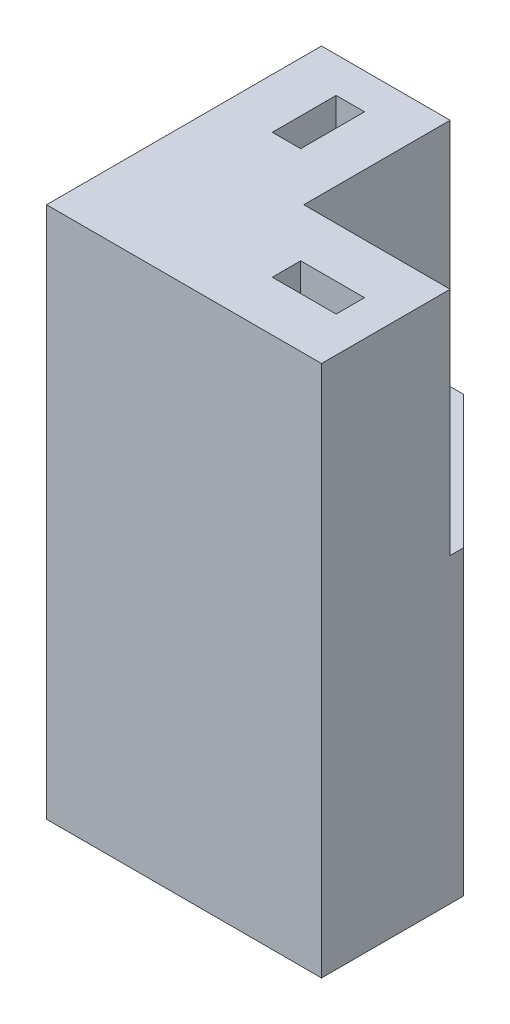
ISO-10303-21;
HEADER;
FILE_DESCRIPTION(('STEP AP214'),'2;1');
FILE_NAME('part.step','',(''),(''),'','','');
FILE_SCHEMA(('AUTOMOTIVE_DESIGN { 1 0 10303 214 1 1 1 1 }'));
ENDSEC;
DATA;
#1=APPLICATION_CONTEXT('core data for automotive mechanical design processes');
#2=APPLICATION_PROTOCOL_DEFINITION('international standard','automotive_design',2000,#1);
#3=PRODUCT_CONTEXT('',#1,'mechanical');
#4=PRODUCT('Part','Part','',(#3));
#5=PRODUCT_RELATED_PRODUCT_CATEGORY('part','',(#4));
#6=PRODUCT_DEFINITION_FORMATION('','',#4);
#7=PRODUCT_DEFINITION_CONTEXT('part definition',#1,'design');
#8=PRODUCT_DEFINITION('design','',#6,#7);
#9=PRODUCT_DEFINITION_SHAPE('','',#8);
#10=(LENGTH_UNIT() NAMED_UNIT(*) SI_UNIT(.MILLI.,.METRE.));
#11=(NAMED_UNIT(*) PLANE_ANGLE_UNIT() SI_UNIT($,.RADIAN.));
#12=(NAMED_UNIT(*) SI_UNIT($,.STERADIAN.) SOLID_ANGLE_UNIT());
#13=UNCERTAINTY_MEASURE_WITH_UNIT(LENGTH_MEASURE(1.E-05),#10,'distance_accuracy_value','');
#14=(GEOMETRIC_REPRESENTATION_CONTEXT(3) GLOBAL_UNCERTAINTY_ASSIGNED_CONTEXT((#13)) GLOBAL_UNIT_ASSIGNED_CONTEXT((#10,
#11,#12)) REPRESENTATION_CONTEXT('',''));
#15=CARTESIAN_POINT('',(0.,0.,0.));
#16=DIRECTION('',(0.,0.,1.));
#17=DIRECTION('',(1.,0.,0.));
#18=AXIS2_PLACEMENT_3D('',#15,#16,#17);
#19=CARTESIAN_POINT('',(9.8425,38.1,9.8425));
#20=DIRECTION('',(-1.,0.,0.));
#21=DIRECTION('',(0.,0.,1.));
#22=AXIS2_PLACEMENT_3D('',#19,#20,#21);
#23=PLANE('',#22);
#24=DIRECTION('',(0.,0.,-1.));
#25=VECTOR('',#24,1.);
#26=CARTESIAN_POINT('',(9.8425,0.,9.8425));
#27=LINE('',#26,#25);
#28=CARTESIAN_POINT('',(9.8425,0.,9.8425));
#29=VERTEX_POINT('',#28);
#30=CARTESIAN_POINT('',(9.8425,0.,-0.317499999999962));
#31=VERTEX_POINT('',#30);
#32=EDGE_CURVE('E249',#29,#31,#27,.T.);
#33=ORIENTED_EDGE('',*,*,#32,.T.);
#34=DIRECTION('',(0.,1.,0.));
#35=VECTOR('',#34,1.);
#36=CARTESIAN_POINT('',(9.8425,38.1,-0.317499999999962));
#37=LINE('',#36,#35);
#38=CARTESIAN_POINT('',(9.8425,21.59,-0.317499999999962));
#39=VERTEX_POINT('',#38);
#40=EDGE_CURVE('E44',#31,#39,#37,.T.);
#41=ORIENTED_EDGE('',*,*,#40,.T.);
#42=DIRECTION('',(0.,0.,-1.));
#43=VECTOR('',#42,1.);
#44=CARTESIAN_POINT('',(9.8425,21.59,-9.8425));
#45=LINE('',#44,#43);
#46=CARTESIAN_POINT('',(9.8425,21.59,0.634999999999998));
#47=VERTEX_POINT('',#46);
#48=EDGE_CURVE('E224',#47,#39,#45,.T.);
#49=ORIENTED_EDGE('',*,*,#48,.F.);
#50=DIRECTION('',(0.,1.,0.));
#51=VECTOR('',#50,1.);
#52=CARTESIAN_POINT('',(9.8425,21.59,0.634999999999998));
#53=LINE('',#52,#51);
#54=CARTESIAN_POINT('',(9.8425,38.1,0.634999999999998));
#55=VERTEX_POINT('',#54);
#56=EDGE_CURVE('E239',#47,#55,#53,.T.);
#57=ORIENTED_EDGE('',*,*,#56,.T.);
#58=DIRECTION('',(0.,0.,-1.));
#59=VECTOR('',#58,1.);
#60=CARTESIAN_POINT('',(9.8425,38.1,9.8425));
#61=LINE('',#60,#59);
#62=CARTESIAN_POINT('',(9.8425,38.1,9.8425));
#63=VERTEX_POINT('',#62);
#64=EDGE_CURVE('E252',#63,#55,#61,.T.);
#65=ORIENTED_EDGE('',*,*,#64,.F.);
#66=DIRECTION('',(0.,-1.,0.));
#67=VECTOR('',#66,1.);
#68=CARTESIAN_POINT('',(9.8425,38.1,9.8425));
#69=LINE('',#68,#67);
#70=EDGE_CURVE('E262',#63,#29,#69,.T.);
#71=ORIENTED_EDGE('',*,*,#70,.T.);
#72=EDGE_LOOP('',(#33,#41,#49,#57,#65,#71));
#73=FACE_BOUND('',#72,.T.);
#74=ADVANCED_FACE('F36',(#73),#23,.F.);
#75=CARTESIAN_POINT('',(-9.8425,38.1,-9.8425));
#76=DIRECTION('',(0.,0.,1.));
#77=DIRECTION('',(1.,0.,0.));
#78=AXIS2_PLACEMENT_3D('',#75,#76,#77);
#79=PLANE('',#78);
#80=DIRECTION('',(-1.,0.,0.));
#81=VECTOR('',#80,1.);
#82=CARTESIAN_POINT('',(-0.634999999999997,21.59,-9.8425));
#83=LINE('',#82,#81);
#84=CARTESIAN_POINT('',(0.3175,21.59,-9.8425));
#85=VERTEX_POINT('',#84);
#86=CARTESIAN_POINT('',(-0.634999999999997,21.59,-9.8425));
#87=VERTEX_POINT('',#86);
#88=EDGE_CURVE('E226',#85,#87,#83,.T.);
#89=ORIENTED_EDGE('',*,*,#88,.F.);
#90=DIRECTION('',(0.,-1.,0.));
#91=VECTOR('',#90,1.);
#92=CARTESIAN_POINT('',(0.3175,38.1,-9.8425));
#93=LINE('',#92,#91);
#94=CARTESIAN_POINT('',(0.3175,0.,-9.8425));
#95=VERTEX_POINT('',#94);
#96=EDGE_CURVE('E277',#85,#95,#93,.T.);
#97=ORIENTED_EDGE('',*,*,#96,.T.);
#98=DIRECTION('',(-1.,0.,0.));
#99=VECTOR('',#98,1.);
#100=CARTESIAN_POINT('',(-9.8425,0.,-9.8425));
#101=LINE('',#100,#99);
#102=CARTESIAN_POINT('',(-9.8425,0.,-9.8425));
#103=VERTEX_POINT('',#102);
#104=EDGE_CURVE('E264',#95,#103,#101,.T.);
#105=ORIENTED_EDGE('',*,*,#104,.T.);
#106=DIRECTION('',(0.,-1.,0.));
#107=VECTOR('',#106,1.);
#108=CARTESIAN_POINT('',(-9.8425,38.1,-9.8425));
#109=LINE('',#108,#107);
#110=CARTESIAN_POINT('',(-9.8425,38.1,-9.8425));
#111=VERTEX_POINT('',#110);
#112=EDGE_CURVE('E274',#111,#103,#109,.T.);
#113=ORIENTED_EDGE('',*,*,#112,.F.);
#114=DIRECTION('',(-1.,0.,0.));
#115=VECTOR('',#114,1.);
#116=CARTESIAN_POINT('',(-9.8425,38.1,-9.8425));
#117=LINE('',#116,#115);
#118=CARTESIAN_POINT('',(-0.634999999999997,38.1,-9.8425));
#119=VERTEX_POINT('',#118);
#120=EDGE_CURVE('E255',#119,#111,#117,.T.);
#121=ORIENTED_EDGE('',*,*,#120,.F.);
#122=DIRECTION('',(0.,1.,0.));
#123=VECTOR('',#122,1.);
#124=CARTESIAN_POINT('',(-0.634999999999997,21.59,-9.8425));
#125=LINE('',#124,#123);
#126=EDGE_CURVE('E235',#87,#119,#125,.T.);
#127=ORIENTED_EDGE('',*,*,#126,.F.);
#128=EDGE_LOOP('',(#89,#97,#105,#113,#121,#127));
#129=FACE_BOUND('',#128,.T.);
#130=ADVANCED_FACE('F283',(#129),#79,.F.);
#131=CARTESIAN_POINT('',(-9.8425,38.1,9.8425));
#132=DIRECTION('',(1.,0.,0.));
#133=DIRECTION('',(0.,0.,-1.));
#134=AXIS2_PLACEMENT_3D('',#131,#132,#133);
#135=PLANE('',#134);
#136=DIRECTION('',(0.,0.,1.));
#137=VECTOR('',#136,1.);
#138=CARTESIAN_POINT('',(-9.8425,0.,9.8425));
#139=LINE('',#138,#137);
#140=CARTESIAN_POINT('',(-9.8425,0.,9.8425));
#141=VERTEX_POINT('',#140);
#142=EDGE_CURVE('E266',#103,#141,#139,.T.);
#143=ORIENTED_EDGE('',*,*,#142,.T.);
#144=DIRECTION('',(0.,-1.,0.));
#145=VECTOR('',#144,1.);
#146=CARTESIAN_POINT('',(-9.8425,38.1,9.8425));
#147=LINE('',#146,#145);
#148=CARTESIAN_POINT('',(-9.8425,38.1,9.8425));
#149=VERTEX_POINT('',#148);
#150=EDGE_CURVE('E271',#149,#141,#147,.T.);
#151=ORIENTED_EDGE('',*,*,#150,.F.);
#152=DIRECTION('',(0.,0.,1.));
#153=VECTOR('',#152,1.);
#154=CARTESIAN_POINT('',(-9.8425,38.1,9.8425));
#155=LINE('',#154,#153);
#156=EDGE_CURVE('E258',#111,#149,#155,.T.);
#157=ORIENTED_EDGE('',*,*,#156,.F.);
#158=ORIENTED_EDGE('',*,*,#112,.T.);
#159=EDGE_LOOP('',(#143,#151,#157,#158));
#160=FACE_BOUND('',#159,.T.);
#161=ADVANCED_FACE('F293',(#160),#135,.F.);
#162=CARTESIAN_POINT('',(-9.8425,38.1,9.8425));
#163=DIRECTION('',(0.,0.,-1.));
#164=DIRECTION('',(-1.,0.,0.));
#165=AXIS2_PLACEMENT_3D('',#162,#163,#164);
#166=PLANE('',#165);
#167=DIRECTION('',(1.,0.,0.));
#168=VECTOR('',#167,1.);
#169=CARTESIAN_POINT('',(-9.8425,0.,9.8425));
#170=LINE('',#169,#168);
#171=EDGE_CURVE('E256',#141,#29,#170,.T.);
#172=ORIENTED_EDGE('',*,*,#171,.T.);
#173=ORIENTED_EDGE('',*,*,#70,.F.);
#174=DIRECTION('',(1.,0.,0.));
#175=VECTOR('',#174,1.);
#176=CARTESIAN_POINT('',(-9.8425,38.1,9.8425));
#177=LINE('',#176,#175);
#178=EDGE_CURVE('E260',#149,#63,#177,.T.);
#179=ORIENTED_EDGE('',*,*,#178,.F.);
#180=ORIENTED_EDGE('',*,*,#150,.T.);
#181=EDGE_LOOP('',(#172,#173,#179,#180));
#182=FACE_BOUND('',#181,.T.);
#183=ADVANCED_FACE('F297',(#182),#166,.F.);
#184=CARTESIAN_POINT('',(0.,38.1,0.));
#185=DIRECTION('',(0.,-1.,0.));
#186=DIRECTION('',(0.,0.,-1.));
#187=AXIS2_PLACEMENT_3D('',#184,#185,#186);
#188=PLANE('',#187);
#189=DIRECTION('',(-1.,0.,0.));
#190=VECTOR('',#189,1.);
#191=CARTESIAN_POINT('',(-6.25475,38.1,-7.3025));
#192=LINE('',#191,#190);
#193=CARTESIAN_POINT('',(-4.22275,38.1,-7.3025));
#194=VERTEX_POINT('',#193);
#195=CARTESIAN_POINT('',(-6.25475,38.1,-7.3025));
#196=VERTEX_POINT('',#195);
#197=EDGE_CURVE('E182',#194,#196,#192,.T.);
#198=ORIENTED_EDGE('',*,*,#197,.F.);
#199=DIRECTION('',(0.,0.,-1.));
#200=VECTOR('',#199,1.);
#201=CARTESIAN_POINT('',(-4.22275,38.1,-2.7305));
#202=LINE('',#201,#200);
#203=CARTESIAN_POINT('',(-4.22275,38.1,-2.7305));
#204=VERTEX_POINT('',#203);
#205=EDGE_CURVE('E156',#204,#194,#202,.T.);
#206=ORIENTED_EDGE('',*,*,#205,.F.);
#207=DIRECTION('',(1.,0.,0.));
#208=VECTOR('',#207,1.);
#209=CARTESIAN_POINT('',(-6.25475,38.1,-2.7305));
#210=LINE('',#209,#208);
#211=CARTESIAN_POINT('',(-6.25475,38.1,-2.7305));
#212=VERTEX_POINT('',#211);
#213=EDGE_CURVE('E173',#212,#204,#210,.T.);
#214=ORIENTED_EDGE('',*,*,#213,.F.);
#215=DIRECTION('',(0.,0.,1.));
#216=VECTOR('',#215,1.);
#217=CARTESIAN_POINT('',(-6.25475,38.1,-2.7305));
#218=LINE('',#217,#216);
#219=EDGE_CURVE('E176',#196,#212,#218,.T.);
#220=ORIENTED_EDGE('',*,*,#219,.F.);
#221=EDGE_LOOP('',(#198,#206,#214,#220));
#222=FACE_BOUND('',#221,.T.);
#223=DIRECTION('',(-1.,0.,0.));
#224=VECTOR('',#223,1.);
#225=CARTESIAN_POINT('',(2.7305,38.1,4.22275));
#226=LINE('',#225,#224);
#227=CARTESIAN_POINT('',(7.3025,38.1,4.22275));
#228=VERTEX_POINT('',#227);
#229=CARTESIAN_POINT('',(2.7305,38.1,4.22275));
#230=VERTEX_POINT('',#229);
#231=EDGE_CURVE('E209',#228,#230,#226,.T.);
#232=ORIENTED_EDGE('',*,*,#231,.F.);
#233=DIRECTION('',(0.,0.,-1.));
#234=VECTOR('',#233,1.);
#235=CARTESIAN_POINT('',(7.3025,38.1,6.25475));
#236=LINE('',#235,#234);
#237=CARTESIAN_POINT('',(7.3025,38.1,6.25475));
#238=VERTEX_POINT('',#237);
#239=EDGE_CURVE('E207',#238,#228,#236,.T.);
#240=ORIENTED_EDGE('',*,*,#239,.F.);
#241=DIRECTION('',(1.,0.,0.));
#242=VECTOR('',#241,1.);
#243=CARTESIAN_POINT('',(2.7305,38.1,6.25475));
#244=LINE('',#243,#242);
#245=CARTESIAN_POINT('',(2.7305,38.1,6.25475));
#246=VERTEX_POINT('',#245);
#247=EDGE_CURVE('E197',#246,#238,#244,.T.);
#248=ORIENTED_EDGE('',*,*,#247,.F.);
#249=DIRECTION('',(0.,0.,1.));
#250=VECTOR('',#249,1.);
#251=CARTESIAN_POINT('',(2.7305,38.1,6.25475));
#252=LINE('',#251,#250);
#253=EDGE_CURVE('E212',#230,#246,#252,.T.);
#254=ORIENTED_EDGE('',*,*,#253,.F.);
#255=EDGE_LOOP('',(#232,#240,#248,#254));
#256=FACE_BOUND('',#255,.T.);
#257=ORIENTED_EDGE('',*,*,#64,.T.);
#258=DIRECTION('',(1.,0.,0.));
#259=VECTOR('',#258,1.);
#260=CARTESIAN_POINT('',(9.8425,38.1,0.634999999999998));
#261=LINE('',#260,#259);
#262=CARTESIAN_POINT('',(-0.634999999999997,38.1,0.635));
#263=VERTEX_POINT('',#262);
#264=EDGE_CURVE('E227',#263,#55,#261,.T.);
#265=ORIENTED_EDGE('',*,*,#264,.F.);
#266=DIRECTION('',(0.,0.,1.));
#267=VECTOR('',#266,1.);
#268=CARTESIAN_POINT('',(-0.634999999999997,38.1,0.635));
#269=LINE('',#268,#267);
#270=EDGE_CURVE('E189',#119,#263,#269,.T.);
#271=ORIENTED_EDGE('',*,*,#270,.F.);
#272=ORIENTED_EDGE('',*,*,#120,.T.);
#273=ORIENTED_EDGE('',*,*,#156,.T.);
#274=ORIENTED_EDGE('',*,*,#178,.T.);
#275=EDGE_LOOP('',(#257,#265,#271,#272,#273,#274));
#276=FACE_BOUND('',#275,.T.);
#277=ADVANCED_FACE('F301',(#222,#256,#276),#188,.F.);
#278=CARTESIAN_POINT('',(0.,0.,0.));
#279=DIRECTION('',(0.,-1.,0.));
#280=DIRECTION('',(0.,0.,-1.));
#281=AXIS2_PLACEMENT_3D('',#278,#279,#280);
#282=PLANE('',#281);
#283=CARTESIAN_POINT('',(-4.92125,0.,4.92125));
#284=DIRECTION('',(0.,-1.,0.));
#285=DIRECTION('',(0.,0.,-1.));
#286=AXIS2_PLACEMENT_3D('',#283,#284,#285);
#287=CIRCLE('',#286,2.54);
#288=CARTESIAN_POINT('',(-4.92125,0.,2.38125));
#289=VERTEX_POINT('',#288);
#290=EDGE_CURVE('E242',#289,#289,#287,.T.);
#291=ORIENTED_EDGE('',*,*,#290,.F.);
#292=EDGE_LOOP('',(#291));
#293=FACE_BOUND('',#292,.T.);
#294=ORIENTED_EDGE('',*,*,#104,.F.);
#295=DIRECTION('',(-0.707106781186546,0.,-0.707106781186549));
#296=VECTOR('',#295,1.);
#297=CARTESIAN_POINT('',(5.08,0.,-5.07999999999998));
#298=LINE('',#297,#296);
#299=EDGE_CURVE('E58',#95,#31,#298,.F.);
#300=ORIENTED_EDGE('',*,*,#299,.T.);
#301=ORIENTED_EDGE('',*,*,#32,.F.);
#302=ORIENTED_EDGE('',*,*,#171,.F.);
#303=ORIENTED_EDGE('',*,*,#142,.F.);
#304=EDGE_LOOP('',(#294,#300,#301,#302,#303));
#305=FACE_BOUND('',#304,.T.);
#306=ADVANCED_FACE('F289',(#293,#305),#282,.T.);
#307=CARTESIAN_POINT('',(-4.92125,5.715,4.92125));
#308=DIRECTION('',(0.,-1.,0.));
#309=DIRECTION('',(0.,0.,-1.));
#310=AXIS2_PLACEMENT_3D('',#307,#308,#309);
#311=CYLINDRICAL_SURFACE('',#310,2.54);
#312=CARTESIAN_POINT('',(-4.92125,5.715,4.92125));
#313=DIRECTION('',(0.,-1.,0.));
#314=DIRECTION('',(0.,0.,-1.));
#315=AXIS2_PLACEMENT_3D('',#312,#313,#314);
#316=CIRCLE('',#315,2.54);
#317=CARTESIAN_POINT('',(-4.92125,5.715,2.38125));
#318=VERTEX_POINT('',#317);
#319=EDGE_CURVE('E246',#318,#318,#316,.T.);
#320=ORIENTED_EDGE('',*,*,#319,.F.);
#321=EDGE_LOOP('',(#320));
#322=FACE_BOUND('',#321,.T.);
#323=ORIENTED_EDGE('',*,*,#290,.T.);
#324=EDGE_LOOP('',(#323));
#325=FACE_BOUND('',#324,.T.);
#326=ADVANCED_FACE('F330',(#322,#325),#311,.F.);
#327=CARTESIAN_POINT('',(-4.92125,5.715,4.92125));
#328=DIRECTION('',(0.,-1.,0.));
#329=DIRECTION('',(0.,0.,-1.));
#330=AXIS2_PLACEMENT_3D('',#327,#328,#329);
#331=PLANE('',#330);
#332=ORIENTED_EDGE('',*,*,#319,.T.);
#333=EDGE_LOOP('',(#332));
#334=FACE_BOUND('',#333,.T.);
#335=ADVANCED_FACE('F337',(#334),#331,.T.);
#336=CARTESIAN_POINT('',(9.8425,21.59,0.634999999999998));
#337=DIRECTION('',(0.,0.,1.));
#338=DIRECTION('',(1.,0.,0.));
#339=AXIS2_PLACEMENT_3D('',#336,#337,#338);
#340=PLANE('',#339);
#341=ORIENTED_EDGE('',*,*,#264,.T.);
#342=ORIENTED_EDGE('',*,*,#56,.F.);
#343=DIRECTION('',(1.,0.,0.));
#344=VECTOR('',#343,1.);
#345=CARTESIAN_POINT('',(9.8425,21.59,0.634999999999998));
#346=LINE('',#345,#344);
#347=CARTESIAN_POINT('',(-0.634999999999997,21.59,0.635));
#348=VERTEX_POINT('',#347);
#349=EDGE_CURVE('E232',#348,#47,#346,.T.);
#350=ORIENTED_EDGE('',*,*,#349,.F.);
#351=DIRECTION('',(0.,1.,0.));
#352=VECTOR('',#351,1.);
#353=CARTESIAN_POINT('',(-0.634999999999997,21.59,0.635));
#354=LINE('',#353,#352);
#355=EDGE_CURVE('E243',#348,#263,#354,.T.);
#356=ORIENTED_EDGE('',*,*,#355,.T.);
#357=EDGE_LOOP('',(#341,#342,#350,#356));
#358=FACE_BOUND('',#357,.T.);
#359=ADVANCED_FACE('F312',(#358),#340,.F.);
#360=CARTESIAN_POINT('',(-0.634999999999997,21.59,0.635));
#361=DIRECTION('',(-1.,0.,0.));
#362=DIRECTION('',(0.,0.,1.));
#363=AXIS2_PLACEMENT_3D('',#360,#361,#362);
#364=PLANE('',#363);
#365=ORIENTED_EDGE('',*,*,#270,.T.);
#366=ORIENTED_EDGE('',*,*,#355,.F.);
#367=DIRECTION('',(0.,0.,1.));
#368=VECTOR('',#367,1.);
#369=CARTESIAN_POINT('',(-0.634999999999997,21.59,0.635));
#370=LINE('',#369,#368);
#371=EDGE_CURVE('E229',#87,#348,#370,.T.);
#372=ORIENTED_EDGE('',*,*,#371,.F.);
#373=ORIENTED_EDGE('',*,*,#126,.T.);
#374=EDGE_LOOP('',(#365,#366,#372,#373));
#375=FACE_BOUND('',#374,.T.);
#376=ADVANCED_FACE('F307',(#375),#364,.F.);
#377=CARTESIAN_POINT('',(0.,21.59,0.));
#378=DIRECTION('',(0.,-1.,0.));
#379=DIRECTION('',(0.,0.,-1.));
#380=AXIS2_PLACEMENT_3D('',#377,#378,#379);
#381=PLANE('',#380);
#382=ORIENTED_EDGE('',*,*,#48,.T.);
#383=DIRECTION('',(0.707106781186546,0.,0.707106781186549));
#384=VECTOR('',#383,1.);
#385=CARTESIAN_POINT('',(0.3175,21.59,-9.8425));
#386=LINE('',#385,#384);
#387=EDGE_CURVE('E11',#39,#85,#386,.F.);
#388=ORIENTED_EDGE('',*,*,#387,.T.);
#389=ORIENTED_EDGE('',*,*,#88,.T.);
#390=ORIENTED_EDGE('',*,*,#371,.T.);
#391=ORIENTED_EDGE('',*,*,#349,.T.);
#392=EDGE_LOOP('',(#382,#388,#389,#390,#391));
#393=FACE_BOUND('',#392,.T.);
#394=ADVANCED_FACE('F310',(#393),#381,.F.);
#395=CARTESIAN_POINT('',(7.3025,33.02,6.25475));
#396=DIRECTION('',(1.,0.,0.));
#397=DIRECTION('',(0.,0.,-1.));
#398=AXIS2_PLACEMENT_3D('',#395,#396,#397);
#399=PLANE('',#398);
#400=ORIENTED_EDGE('',*,*,#239,.T.);
#401=DIRECTION('',(0.,1.,0.));
#402=VECTOR('',#401,1.);
#403=CARTESIAN_POINT('',(7.3025,33.02,4.22275));
#404=LINE('',#403,#402);
#405=CARTESIAN_POINT('',(7.3025,33.02,4.22275));
#406=VERTEX_POINT('',#405);
#407=EDGE_CURVE('E206',#406,#228,#404,.T.);
#408=ORIENTED_EDGE('',*,*,#407,.F.);
#409=DIRECTION('',(0.,0.,-1.));
#410=VECTOR('',#409,1.);
#411=CARTESIAN_POINT('',(7.3025,33.02,6.25475));
#412=LINE('',#411,#410);
#413=CARTESIAN_POINT('',(7.3025,33.02,6.25475));
#414=VERTEX_POINT('',#413);
#415=EDGE_CURVE('E193',#414,#406,#412,.T.);
#416=ORIENTED_EDGE('',*,*,#415,.F.);
#417=DIRECTION('',(0.,1.,0.));
#418=VECTOR('',#417,1.);
#419=CARTESIAN_POINT('',(7.3025,33.02,6.25475));
#420=LINE('',#419,#418);
#421=EDGE_CURVE('E183',#414,#238,#420,.T.);
#422=ORIENTED_EDGE('',*,*,#421,.T.);
#423=EDGE_LOOP('',(#400,#408,#416,#422));
#424=FACE_BOUND('',#423,.T.);
#425=ADVANCED_FACE('F348',(#424),#399,.F.);
#426=CARTESIAN_POINT('',(2.7305,33.02,6.25475));
#427=DIRECTION('',(0.,0.,1.));
#428=DIRECTION('',(1.,0.,0.));
#429=AXIS2_PLACEMENT_3D('',#426,#427,#428);
#430=PLANE('',#429);
#431=ORIENTED_EDGE('',*,*,#247,.T.);
#432=ORIENTED_EDGE('',*,*,#421,.F.);
#433=DIRECTION('',(1.,0.,0.));
#434=VECTOR('',#433,1.);
#435=CARTESIAN_POINT('',(2.7305,33.02,6.25475));
#436=LINE('',#435,#434);
#437=CARTESIAN_POINT('',(2.7305,33.02,6.25475));
#438=VERTEX_POINT('',#437);
#439=EDGE_CURVE('E203',#438,#414,#436,.T.);
#440=ORIENTED_EDGE('',*,*,#439,.F.);
#441=DIRECTION('',(0.,1.,0.));
#442=VECTOR('',#441,1.);
#443=CARTESIAN_POINT('',(2.7305,33.02,6.25475));
#444=LINE('',#443,#442);
#445=EDGE_CURVE('E218',#438,#246,#444,.T.);
#446=ORIENTED_EDGE('',*,*,#445,.T.);
#447=EDGE_LOOP('',(#431,#432,#440,#446));
#448=FACE_BOUND('',#447,.T.);
#449=ADVANCED_FACE('F351',(#448),#430,.F.);
#450=CARTESIAN_POINT('',(2.7305,33.02,6.25475));
#451=DIRECTION('',(-1.,0.,0.));
#452=DIRECTION('',(0.,0.,1.));
#453=AXIS2_PLACEMENT_3D('',#450,#451,#452);
#454=PLANE('',#453);
#455=ORIENTED_EDGE('',*,*,#253,.T.);
#456=ORIENTED_EDGE('',*,*,#445,.F.);
#457=DIRECTION('',(0.,0.,1.));
#458=VECTOR('',#457,1.);
#459=CARTESIAN_POINT('',(2.7305,33.02,6.25475));
#460=LINE('',#459,#458);
#461=CARTESIAN_POINT('',(2.7305,33.02,4.22275));
#462=VERTEX_POINT('',#461);
#463=EDGE_CURVE('E200',#462,#438,#460,.T.);
#464=ORIENTED_EDGE('',*,*,#463,.F.);
#465=DIRECTION('',(0.,1.,0.));
#466=VECTOR('',#465,1.);
#467=CARTESIAN_POINT('',(2.7305,33.02,4.22275));
#468=LINE('',#467,#466);
#469=EDGE_CURVE('E220',#462,#230,#468,.T.);
#470=ORIENTED_EDGE('',*,*,#469,.T.);
#471=EDGE_LOOP('',(#455,#456,#464,#470));
#472=FACE_BOUND('',#471,.T.);
#473=ADVANCED_FACE('F357',(#472),#454,.F.);
#474=CARTESIAN_POINT('',(2.7305,33.02,4.22275));
#475=DIRECTION('',(0.,0.,-1.));
#476=DIRECTION('',(-1.,0.,0.));
#477=AXIS2_PLACEMENT_3D('',#474,#475,#476);
#478=PLANE('',#477);
#479=ORIENTED_EDGE('',*,*,#231,.T.);
#480=ORIENTED_EDGE('',*,*,#469,.F.);
#481=DIRECTION('',(-1.,0.,0.));
#482=VECTOR('',#481,1.);
#483=CARTESIAN_POINT('',(2.7305,33.02,4.22275));
#484=LINE('',#483,#482);
#485=EDGE_CURVE('E196',#406,#462,#484,.T.);
#486=ORIENTED_EDGE('',*,*,#485,.F.);
#487=ORIENTED_EDGE('',*,*,#407,.T.);
#488=EDGE_LOOP('',(#479,#480,#486,#487));
#489=FACE_BOUND('',#488,.T.);
#490=ADVANCED_FACE('F353',(#489),#478,.F.);
#491=CARTESIAN_POINT('',(0.,33.02,0.));
#492=DIRECTION('',(0.,-1.,0.));
#493=DIRECTION('',(0.,0.,-1.));
#494=AXIS2_PLACEMENT_3D('',#491,#492,#493);
#495=PLANE('',#494);
#496=ORIENTED_EDGE('',*,*,#415,.T.);
#497=ORIENTED_EDGE('',*,*,#485,.T.);
#498=ORIENTED_EDGE('',*,*,#463,.T.);
#499=ORIENTED_EDGE('',*,*,#439,.T.);
#500=EDGE_LOOP('',(#496,#497,#498,#499));
#501=FACE_BOUND('',#500,.T.);
#502=ADVANCED_FACE('F356',(#501),#495,.F.);
#503=CARTESIAN_POINT('',(-4.22275,33.02,-2.7305));
#504=DIRECTION('',(1.,0.,0.));
#505=DIRECTION('',(0.,0.,-1.));
#506=AXIS2_PLACEMENT_3D('',#503,#504,#505);
#507=PLANE('',#506);
#508=ORIENTED_EDGE('',*,*,#205,.T.);
#509=DIRECTION('',(0.,1.,0.));
#510=VECTOR('',#509,1.);
#511=CARTESIAN_POINT('',(-4.22275,33.02,-7.3025));
#512=LINE('',#511,#510);
#513=CARTESIAN_POINT('',(-4.22275,33.02,-7.3025));
#514=VERTEX_POINT('',#513);
#515=EDGE_CURVE('E149',#514,#194,#512,.T.);
#516=ORIENTED_EDGE('',*,*,#515,.F.);
#517=DIRECTION('',(0.,0.,-1.));
#518=VECTOR('',#517,1.);
#519=CARTESIAN_POINT('',(-4.22275,33.02,-2.7305));
#520=LINE('',#519,#518);
#521=CARTESIAN_POINT('',(-4.22275,33.02,-2.7305));
#522=VERTEX_POINT('',#521);
#523=EDGE_CURVE('E153',#522,#514,#520,.T.);
#524=ORIENTED_EDGE('',*,*,#523,.F.);
#525=DIRECTION('',(0.,1.,0.));
#526=VECTOR('',#525,1.);
#527=CARTESIAN_POINT('',(-4.22275,33.02,-2.7305));
#528=LINE('',#527,#526);
#529=EDGE_CURVE('E187',#522,#204,#528,.T.);
#530=ORIENTED_EDGE('',*,*,#529,.T.);
#531=EDGE_LOOP('',(#508,#516,#524,#530));
#532=FACE_BOUND('',#531,.T.);
#533=ADVANCED_FACE('F151',(#532),#507,.F.);
#534=CARTESIAN_POINT('',(-6.25475,33.02,-2.7305));
#535=DIRECTION('',(0.,0.,1.));
#536=DIRECTION('',(1.,0.,0.));
#537=AXIS2_PLACEMENT_3D('',#534,#535,#536);
#538=PLANE('',#537);
#539=ORIENTED_EDGE('',*,*,#213,.T.);
#540=ORIENTED_EDGE('',*,*,#529,.F.);
#541=DIRECTION('',(1.,0.,0.));
#542=VECTOR('',#541,1.);
#543=CARTESIAN_POINT('',(-6.25475,33.02,-2.7305));
#544=LINE('',#543,#542);
#545=CARTESIAN_POINT('',(-6.25475,33.02,-2.7305));
#546=VERTEX_POINT('',#545);
#547=EDGE_CURVE('E161',#546,#522,#544,.T.);
#548=ORIENTED_EDGE('',*,*,#547,.F.);
#549=DIRECTION('',(0.,1.,0.));
#550=VECTOR('',#549,1.);
#551=CARTESIAN_POINT('',(-6.25475,33.02,-2.7305));
#552=LINE('',#551,#550);
#553=EDGE_CURVE('E190',#546,#212,#552,.T.);
#554=ORIENTED_EDGE('',*,*,#553,.T.);
#555=EDGE_LOOP('',(#539,#540,#548,#554));
#556=FACE_BOUND('',#555,.T.);
#557=ADVANCED_FACE('F370',(#556),#538,.F.);
#558=CARTESIAN_POINT('',(-6.25475,33.02,-2.7305));
#559=DIRECTION('',(-1.,0.,0.));
#560=DIRECTION('',(0.,0.,1.));
#561=AXIS2_PLACEMENT_3D('',#558,#559,#560);
#562=PLANE('',#561);
#563=ORIENTED_EDGE('',*,*,#219,.T.);
#564=ORIENTED_EDGE('',*,*,#553,.F.);
#565=DIRECTION('',(0.,0.,1.));
#566=VECTOR('',#565,1.);
#567=CARTESIAN_POINT('',(-6.25475,33.02,-2.7305));
#568=LINE('',#567,#566);
#569=CARTESIAN_POINT('',(-6.25475,33.02,-7.3025));
#570=VERTEX_POINT('',#569);
#571=EDGE_CURVE('E169',#570,#546,#568,.T.);
#572=ORIENTED_EDGE('',*,*,#571,.F.);
#573=DIRECTION('',(0.,1.,0.));
#574=VECTOR('',#573,1.);
#575=CARTESIAN_POINT('',(-6.25475,33.02,-7.3025));
#576=LINE('',#575,#574);
#577=EDGE_CURVE('E160',#570,#196,#576,.T.);
#578=ORIENTED_EDGE('',*,*,#577,.T.);
#579=EDGE_LOOP('',(#563,#564,#572,#578));
#580=FACE_BOUND('',#579,.T.);
#581=ADVANCED_FACE('F373',(#580),#562,.F.);
#582=CARTESIAN_POINT('',(-6.25475,33.02,-7.3025));
#583=DIRECTION('',(0.,0.,-1.));
#584=DIRECTION('',(-1.,0.,0.));
#585=AXIS2_PLACEMENT_3D('',#582,#583,#584);
#586=PLANE('',#585);
#587=ORIENTED_EDGE('',*,*,#197,.T.);
#588=ORIENTED_EDGE('',*,*,#577,.F.);
#589=DIRECTION('',(-1.,0.,0.));
#590=VECTOR('',#589,1.);
#591=CARTESIAN_POINT('',(-6.25475,33.02,-7.3025));
#592=LINE('',#591,#590);
#593=EDGE_CURVE('E164',#514,#570,#592,.T.);
#594=ORIENTED_EDGE('',*,*,#593,.F.);
#595=ORIENTED_EDGE('',*,*,#515,.T.);
#596=EDGE_LOOP('',(#587,#588,#594,#595));
#597=FACE_BOUND('',#596,.T.);
#598=ADVANCED_FACE('F165',(#597),#586,.F.);
#599=CARTESIAN_POINT('',(0.,33.02,0.));
#600=DIRECTION('',(0.,-1.,0.));
#601=DIRECTION('',(0.,0.,-1.));
#602=AXIS2_PLACEMENT_3D('',#599,#600,#601);
#603=PLANE('',#602);
#604=ORIENTED_EDGE('',*,*,#523,.T.);
#605=ORIENTED_EDGE('',*,*,#593,.T.);
#606=ORIENTED_EDGE('',*,*,#571,.T.);
#607=ORIENTED_EDGE('',*,*,#547,.T.);
#608=EDGE_LOOP('',(#604,#605,#606,#607));
#609=FACE_BOUND('',#608,.T.);
#610=ADVANCED_FACE('F171',(#609),#603,.F.);
#611=CARTESIAN_POINT('',(0.3175,38.1,-9.8425));
#612=DIRECTION('',(-0.707106781186549,0.,0.707106781186546));
#613=DIRECTION('',(0.,-1.,0.));
#614=AXIS2_PLACEMENT_3D('',#611,#612,#613);
#615=PLANE('',#614);
#616=ORIENTED_EDGE('',*,*,#387,.F.);
#617=ORIENTED_EDGE('',*,*,#40,.F.);
#618=ORIENTED_EDGE('',*,*,#299,.F.);
#619=ORIENTED_EDGE('',*,*,#96,.F.);
#620=EDGE_LOOP('',(#616,#617,#618,#619));
#621=FACE_BOUND('',#620,.T.);
#622=ADVANCED_FACE('F38',(#621),#615,.F.);
#623=CLOSED_SHELL('',(#74,#130,#161,#183,#277,#306,#326,#335,#359,#376,#394,#425,#449,#473,#490,
#502,#533,#557,#581,#598,#610,#622));
#624=MANIFOLD_SOLID_BREP('B2',#623);
#625=ADVANCED_BREP_SHAPE_REPRESENTATION('',(#18,#624),#14);
#626=SHAPE_DEFINITION_REPRESENTATION(#9,#625);
ENDSEC;
END-ISO-10303-21;
